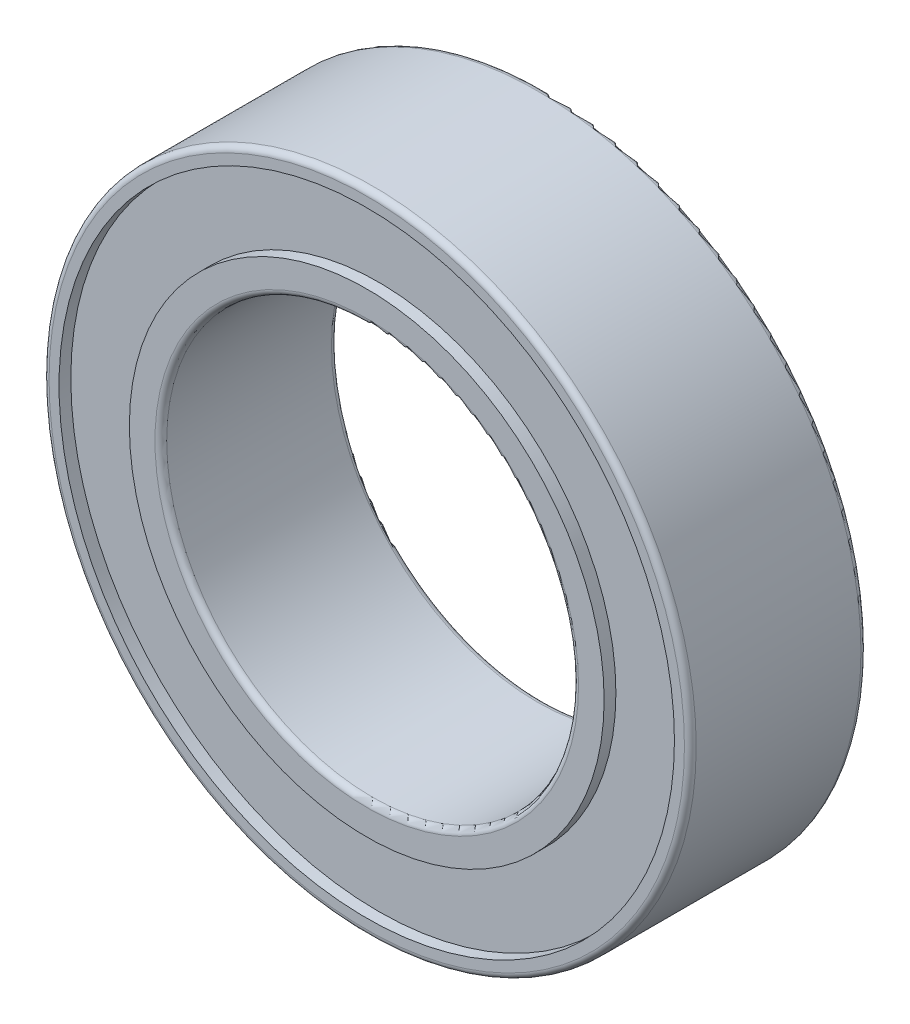
ISO-10303-21;
HEADER;
FILE_DESCRIPTION(('STEP AP214'),'2;1');
FILE_NAME('part.step','',(''),(''),'','','');
FILE_SCHEMA(('AUTOMOTIVE_DESIGN { 1 0 10303 214 1 1 1 1 }'));
ENDSEC;
DATA;
#1=APPLICATION_CONTEXT('core data for automotive mechanical design processes');
#2=APPLICATION_PROTOCOL_DEFINITION('international standard','automotive_design',2000,#1);
#3=PRODUCT_CONTEXT('',#1,'mechanical');
#4=PRODUCT('Part','Part','',(#3));
#5=PRODUCT_RELATED_PRODUCT_CATEGORY('part','',(#4));
#6=PRODUCT_DEFINITION_FORMATION('','',#4);
#7=PRODUCT_DEFINITION_CONTEXT('part definition',#1,'design');
#8=PRODUCT_DEFINITION('design','',#6,#7);
#9=PRODUCT_DEFINITION_SHAPE('','',#8);
#10=(LENGTH_UNIT() NAMED_UNIT(*) SI_UNIT(.MILLI.,.METRE.));
#11=(NAMED_UNIT(*) PLANE_ANGLE_UNIT() SI_UNIT($,.RADIAN.));
#12=(NAMED_UNIT(*) SI_UNIT($,.STERADIAN.) SOLID_ANGLE_UNIT());
#13=UNCERTAINTY_MEASURE_WITH_UNIT(LENGTH_MEASURE(1.E-05),#10,'distance_accuracy_value','');
#14=(GEOMETRIC_REPRESENTATION_CONTEXT(3) GLOBAL_UNCERTAINTY_ASSIGNED_CONTEXT((#13)) GLOBAL_UNIT_ASSIGNED_CONTEXT((#10,
#11,#12)) REPRESENTATION_CONTEXT('',''));
#15=CARTESIAN_POINT('',(0.,0.,0.));
#16=DIRECTION('',(0.,0.,1.));
#17=DIRECTION('',(1.,0.,0.));
#18=AXIS2_PLACEMENT_3D('',#15,#16,#17);
#19=CARTESIAN_POINT('',(-4.03500000000001,-4.03500000000003,0.));
#20=DIRECTION('',(0.,0.,1.));
#21=DIRECTION('',(1.,0.,0.));
#22=AXIS2_PLACEMENT_3D('',#19,#20,#21);
#23=PLANE('',#22);
#24=CARTESIAN_POINT('',(0.,0.,0.));
#25=DIRECTION('',(0.,0.,1.));
#26=DIRECTION('',(-1.,0.,0.));
#27=AXIS2_PLACEMENT_3D('',#24,#25,#26);
#28=CIRCLE('',#27,4.035);
#29=CARTESIAN_POINT('',(-4.035,0.,0.));
#30=VERTEX_POINT('',#29);
#31=EDGE_CURVE('E67',#30,#30,#28,.F.);
#32=ORIENTED_EDGE('',*,*,#31,.F.);
#33=EDGE_LOOP('',(#32));
#34=FACE_BOUND('',#33,.T.);
#35=CARTESIAN_POINT('',(0.,0.,0.));
#36=DIRECTION('',(0.,0.,-1.));
#37=DIRECTION('',(1.,0.,0.));
#38=AXIS2_PLACEMENT_3D('',#35,#36,#37);
#39=CIRCLE('',#38,3.59999999999993);
#40=CARTESIAN_POINT('',(3.59999999999993,0.,0.));
#41=VERTEX_POINT('',#40);
#42=EDGE_CURVE('E64',#41,#41,#39,.T.);
#43=ORIENTED_EDGE('',*,*,#42,.T.);
#44=EDGE_LOOP('',(#43));
#45=FACE_BOUND('',#44,.T.);
#46=ADVANCED_FACE('F14',(#34,#45),#23,.T.);
#47=CARTESIAN_POINT('',(4.035,-4.035,-3.));
#48=DIRECTION('',(0.,0.,-1.));
#49=DIRECTION('',(-1.,0.,0.));
#50=AXIS2_PLACEMENT_3D('',#47,#48,#49);
#51=PLANE('',#50);
#52=CARTESIAN_POINT('',(0.,0.,-3.));
#53=DIRECTION('',(0.,0.,-1.));
#54=DIRECTION('',(1.,0.,0.));
#55=AXIS2_PLACEMENT_3D('',#52,#53,#54);
#56=CIRCLE('',#55,4.035);
#57=CARTESIAN_POINT('',(4.035,0.,-3.));
#58=VERTEX_POINT('',#57);
#59=EDGE_CURVE('E61',#58,#58,#56,.T.);
#60=ORIENTED_EDGE('',*,*,#59,.T.);
#61=EDGE_LOOP('',(#60));
#62=FACE_BOUND('',#61,.T.);
#63=CARTESIAN_POINT('',(0.,0.,-3.));
#64=DIRECTION('',(0.,0.,1.));
#65=DIRECTION('',(-1.,0.,0.));
#66=AXIS2_PLACEMENT_3D('',#63,#64,#65);
#67=CIRCLE('',#66,3.60000001788124);
#68=CARTESIAN_POINT('',(-3.60000001788124,0.,-3.));
#69=VERTEX_POINT('',#68);
#70=EDGE_CURVE('E58',#69,#69,#67,.F.);
#71=ORIENTED_EDGE('',*,*,#70,.F.);
#72=EDGE_LOOP('',(#71));
#73=FACE_BOUND('',#72,.T.);
#74=ADVANCED_FACE('F75',(#62,#73),#51,.T.);
#75=CARTESIAN_POINT('',(5.23,-5.30055069282541,-2.8));
#76=DIRECTION('',(0.,0.,-1.));
#77=DIRECTION('',(-1.,0.,0.));
#78=AXIS2_PLACEMENT_3D('',#75,#76,#77);
#79=PLANE('',#78);
#80=CARTESIAN_POINT('',(0.,0.,-2.8));
#81=DIRECTION('',(0.,0.,-1.));
#82=DIRECTION('',(1.,0.,0.));
#83=AXIS2_PLACEMENT_3D('',#80,#81,#82);
#84=CIRCLE('',#83,5.23);
#85=CARTESIAN_POINT('',(5.23,0.,-2.8));
#86=VERTEX_POINT('',#85);
#87=EDGE_CURVE('E55',#86,#86,#84,.T.);
#88=ORIENTED_EDGE('',*,*,#87,.T.);
#89=EDGE_LOOP('',(#88));
#90=FACE_BOUND('',#89,.T.);
#91=CARTESIAN_POINT('',(0.,0.,-2.8));
#92=DIRECTION('',(0.,0.,1.));
#93=DIRECTION('',(-1.,0.,0.));
#94=AXIS2_PLACEMENT_3D('',#91,#92,#93);
#95=CIRCLE('',#94,4.035);
#96=CARTESIAN_POINT('',(-4.035,0.,-2.8));
#97=VERTEX_POINT('',#96);
#98=EDGE_CURVE('E52',#97,#97,#95,.F.);
#99=ORIENTED_EDGE('',*,*,#98,.F.);
#100=EDGE_LOOP('',(#99));
#101=FACE_BOUND('',#100,.T.);
#102=ADVANCED_FACE('F134',(#90,#101),#79,.T.);
#103=CARTESIAN_POINT('',(5.4,-5.4,-3.));
#104=DIRECTION('',(0.,0.,-1.));
#105=DIRECTION('',(-1.,0.,0.));
#106=AXIS2_PLACEMENT_3D('',#103,#104,#105);
#107=PLANE('',#106);
#108=CARTESIAN_POINT('',(0.,0.,-3.));
#109=DIRECTION('',(0.,0.,-1.));
#110=DIRECTION('',(1.,0.,0.));
#111=AXIS2_PLACEMENT_3D('',#108,#109,#110);
#112=CIRCLE('',#111,5.4);
#113=CARTESIAN_POINT('',(5.4,0.,-3.));
#114=VERTEX_POINT('',#113);
#115=EDGE_CURVE('E49',#114,#114,#112,.T.);
#116=ORIENTED_EDGE('',*,*,#115,.T.);
#117=EDGE_LOOP('',(#116));
#118=FACE_BOUND('',#117,.T.);
#119=CARTESIAN_POINT('',(0.,0.,-3.));
#120=DIRECTION('',(0.,0.,1.));
#121=DIRECTION('',(-1.,0.,0.));
#122=AXIS2_PLACEMENT_3D('',#119,#120,#121);
#123=CIRCLE('',#122,5.23);
#124=CARTESIAN_POINT('',(-5.23,0.,-3.));
#125=VERTEX_POINT('',#124);
#126=EDGE_CURVE('E46',#125,#125,#123,.F.);
#127=ORIENTED_EDGE('',*,*,#126,.F.);
#128=EDGE_LOOP('',(#127));
#129=FACE_BOUND('',#128,.T.);
#130=ADVANCED_FACE('F129',(#118,#129),#107,.T.);
#131=CARTESIAN_POINT('',(-5.4,-5.4,0.));
#132=DIRECTION('',(0.,0.,1.));
#133=DIRECTION('',(1.,0.,0.));
#134=AXIS2_PLACEMENT_3D('',#131,#132,#133);
#135=PLANE('',#134);
#136=CARTESIAN_POINT('',(0.,0.,0.));
#137=DIRECTION('',(0.,0.,1.));
#138=DIRECTION('',(-1.,0.,0.));
#139=AXIS2_PLACEMENT_3D('',#136,#137,#138);
#140=CIRCLE('',#139,5.40000000745066);
#141=CARTESIAN_POINT('',(-5.40000000745066,0.,0.));
#142=VERTEX_POINT('',#141);
#143=EDGE_CURVE('E43',#142,#142,#140,.F.);
#144=ORIENTED_EDGE('',*,*,#143,.F.);
#145=EDGE_LOOP('',(#144));
#146=FACE_BOUND('',#145,.T.);
#147=CARTESIAN_POINT('',(0.,0.,0.));
#148=DIRECTION('',(0.,0.,-1.));
#149=DIRECTION('',(1.,0.,0.));
#150=AXIS2_PLACEMENT_3D('',#147,#148,#149);
#151=CIRCLE('',#150,5.23);
#152=CARTESIAN_POINT('',(5.23,0.,0.));
#153=VERTEX_POINT('',#152);
#154=EDGE_CURVE('E40',#153,#153,#151,.T.);
#155=ORIENTED_EDGE('',*,*,#154,.T.);
#156=EDGE_LOOP('',(#155));
#157=FACE_BOUND('',#156,.T.);
#158=ADVANCED_FACE('F93',(#146,#157),#135,.T.);
#159=CARTESIAN_POINT('',(-5.23,-5.30055069282541,-0.2));
#160=DIRECTION('',(0.,0.,1.));
#161=DIRECTION('',(1.,0.,0.));
#162=AXIS2_PLACEMENT_3D('',#159,#160,#161);
#163=PLANE('',#162);
#164=CARTESIAN_POINT('',(0.,0.,-0.2));
#165=DIRECTION('',(0.,0.,1.));
#166=DIRECTION('',(-1.,0.,0.));
#167=AXIS2_PLACEMENT_3D('',#164,#165,#166);
#168=CIRCLE('',#167,5.23);
#169=CARTESIAN_POINT('',(-5.23,0.,-0.2));
#170=VERTEX_POINT('',#169);
#171=EDGE_CURVE('E37',#170,#170,#168,.F.);
#172=ORIENTED_EDGE('',*,*,#171,.F.);
#173=EDGE_LOOP('',(#172));
#174=FACE_BOUND('',#173,.T.);
#175=CARTESIAN_POINT('',(0.,0.,-0.2));
#176=DIRECTION('',(0.,0.,-1.));
#177=DIRECTION('',(1.,0.,0.));
#178=AXIS2_PLACEMENT_3D('',#175,#176,#177);
#179=CIRCLE('',#178,4.035);
#180=CARTESIAN_POINT('',(4.035,0.,-0.2));
#181=VERTEX_POINT('',#180);
#182=EDGE_CURVE('E34',#181,#181,#179,.T.);
#183=ORIENTED_EDGE('',*,*,#182,.T.);
#184=EDGE_LOOP('',(#183));
#185=FACE_BOUND('',#184,.T.);
#186=ADVANCED_FACE('F82',(#174,#185),#163,.T.);
#187=CARTESIAN_POINT('',(0.,0.,-0.099999999999923));
#188=DIRECTION('',(0.,0.,-1.));
#189=DIRECTION('',(1.,0.,0.));
#190=AXIS2_PLACEMENT_3D('',#187,#188,#189);
#191=TOROIDAL_SURFACE('',#190,3.59999999999993,0.099999999999923);
#192=CARTESIAN_POINT('',(0.,0.,-0.1));
#193=DIRECTION('',(0.,0.,-1.));
#194=DIRECTION('',(1.,0.,0.));
#195=AXIS2_PLACEMENT_3D('',#192,#193,#194);
#196=CIRCLE('',#195,3.5);
#197=CARTESIAN_POINT('',(3.5,0.,-0.1));
#198=VERTEX_POINT('',#197);
#199=EDGE_CURVE('E29',#198,#198,#196,.T.);
#200=ORIENTED_EDGE('',*,*,#199,.T.);
#201=EDGE_LOOP('',(#200));
#202=FACE_BOUND('',#201,.T.);
#203=ORIENTED_EDGE('',*,*,#42,.F.);
#204=EDGE_LOOP('',(#203));
#205=FACE_BOUND('',#204,.T.);
#206=ADVANCED_FACE('F79',(#202,#205),#191,.T.);
#207=CARTESIAN_POINT('',(0.,0.,-3.));
#208=DIRECTION('',(0.,0.,-1.));
#209=DIRECTION('',(1.,0.,0.));
#210=AXIS2_PLACEMENT_3D('',#207,#208,#209);
#211=CYLINDRICAL_SURFACE('',#210,3.5);
#212=CARTESIAN_POINT('',(0.,0.,-2.9));
#213=DIRECTION('',(0.,0.,-1.));
#214=DIRECTION('',(1.,0.,0.));
#215=AXIS2_PLACEMENT_3D('',#212,#213,#214);
#216=CIRCLE('',#215,3.5);
#217=CARTESIAN_POINT('',(3.5,0.,-2.9));
#218=VERTEX_POINT('',#217);
#219=EDGE_CURVE('E25',#218,#218,#216,.T.);
#220=ORIENTED_EDGE('',*,*,#219,.T.);
#221=EDGE_LOOP('',(#220));
#222=FACE_BOUND('',#221,.T.);
#223=ORIENTED_EDGE('',*,*,#199,.F.);
#224=EDGE_LOOP('',(#223));
#225=FACE_BOUND('',#224,.T.);
#226=ADVANCED_FACE('F81',(#222,#225),#211,.F.);
#227=CARTESIAN_POINT('',(0.,0.,-2.90000000000015));
#228=DIRECTION('',(0.,0.,-1.));
#229=DIRECTION('',(0.99999999999999,1.42046885487697E-07,0.));
#230=AXIS2_PLACEMENT_3D('',#227,#228,#229);
#231=TOROIDAL_SURFACE('',#230,3.59999999999985,0.0999999999998467);
#232=ORIENTED_EDGE('',*,*,#70,.T.);
#233=EDGE_LOOP('',(#232));
#234=FACE_BOUND('',#233,.T.);
#235=ORIENTED_EDGE('',*,*,#219,.F.);
#236=EDGE_LOOP('',(#235));
#237=FACE_BOUND('',#236,.T.);
#238=ADVANCED_FACE('F90',(#234,#237),#231,.T.);
#239=CARTESIAN_POINT('',(0.,0.,-3.));
#240=DIRECTION('',(0.,0.,-1.));
#241=DIRECTION('',(0.99999999999999,1.42053890994982E-07,0.));
#242=AXIS2_PLACEMENT_3D('',#239,#240,#241);
#243=CYLINDRICAL_SURFACE('',#242,4.035);
#244=ORIENTED_EDGE('',*,*,#98,.T.);
#245=EDGE_LOOP('',(#244));
#246=FACE_BOUND('',#245,.T.);
#247=ORIENTED_EDGE('',*,*,#59,.F.);
#248=EDGE_LOOP('',(#247));
#249=FACE_BOUND('',#248,.T.);
#250=ADVANCED_FACE('F100',(#246,#249),#243,.T.);
#251=CARTESIAN_POINT('',(0.,0.,-3.));
#252=DIRECTION('',(0.,0.,-1.));
#253=DIRECTION('',(1.,0.,0.));
#254=AXIS2_PLACEMENT_3D('',#251,#252,#253);
#255=CYLINDRICAL_SURFACE('',#254,5.23);
#256=ORIENTED_EDGE('',*,*,#126,.T.);
#257=EDGE_LOOP('',(#256));
#258=FACE_BOUND('',#257,.T.);
#259=ORIENTED_EDGE('',*,*,#87,.F.);
#260=EDGE_LOOP('',(#259));
#261=FACE_BOUND('',#260,.T.);
#262=ADVANCED_FACE('F104',(#258,#261),#255,.F.);
#263=CARTESIAN_POINT('',(0.,0.,-2.90000000000015));
#264=DIRECTION('',(0.,0.,-1.));
#265=DIRECTION('',(1.,0.,0.));
#266=AXIS2_PLACEMENT_3D('',#263,#264,#265);
#267=TOROIDAL_SURFACE('',#266,5.40000000000016,0.099999999999845);
#268=CARTESIAN_POINT('',(0.,0.,-2.90000000000015));
#269=DIRECTION('',(0.,0.,-1.));
#270=DIRECTION('',(1.,0.,0.));
#271=AXIS2_PLACEMENT_3D('',#268,#269,#270);
#272=CIRCLE('',#271,5.50000000000001);
#273=CARTESIAN_POINT('',(5.50000000000001,0.,-2.90000000000015));
#274=VERTEX_POINT('',#273);
#275=EDGE_CURVE('E21',#274,#274,#272,.T.);
#276=ORIENTED_EDGE('',*,*,#275,.T.);
#277=EDGE_LOOP('',(#276));
#278=FACE_BOUND('',#277,.T.);
#279=ORIENTED_EDGE('',*,*,#115,.F.);
#280=EDGE_LOOP('',(#279));
#281=FACE_BOUND('',#280,.T.);
#282=ADVANCED_FACE('F108',(#278,#281),#267,.T.);
#283=CARTESIAN_POINT('',(0.,0.,-3.));
#284=DIRECTION('',(0.,0.,-1.));
#285=DIRECTION('',(1.,0.,0.));
#286=AXIS2_PLACEMENT_3D('',#283,#284,#285);
#287=CYLINDRICAL_SURFACE('',#286,5.5);
#288=CARTESIAN_POINT('',(0.,0.,-0.0999999999999219));
#289=DIRECTION('',(0.,0.,-1.));
#290=DIRECTION('',(1.,0.,0.));
#291=AXIS2_PLACEMENT_3D('',#288,#289,#290);
#292=CIRCLE('',#291,5.5);
#293=CARTESIAN_POINT('',(5.5,0.,-0.0999999999999219));
#294=VERTEX_POINT('',#293);
#295=EDGE_CURVE('E9',#294,#294,#292,.T.);
#296=ORIENTED_EDGE('',*,*,#295,.T.);
#297=EDGE_LOOP('',(#296));
#298=FACE_BOUND('',#297,.T.);
#299=ORIENTED_EDGE('',*,*,#275,.F.);
#300=EDGE_LOOP('',(#299));
#301=FACE_BOUND('',#300,.T.);
#302=ADVANCED_FACE('F112',(#298,#301),#287,.T.);
#303=CARTESIAN_POINT('',(0.,0.,-0.0999999999999217));
#304=DIRECTION('',(0.,0.,-1.));
#305=DIRECTION('',(1.,0.,0.));
#306=AXIS2_PLACEMENT_3D('',#303,#304,#305);
#307=TOROIDAL_SURFACE('',#306,5.40000000000008,0.0999999999999222);
#308=ORIENTED_EDGE('',*,*,#143,.T.);
#309=EDGE_LOOP('',(#308));
#310=FACE_BOUND('',#309,.T.);
#311=ORIENTED_EDGE('',*,*,#295,.F.);
#312=EDGE_LOOP('',(#311));
#313=FACE_BOUND('',#312,.T.);
#314=ADVANCED_FACE('F115',(#310,#313),#307,.T.);
#315=CARTESIAN_POINT('',(0.,0.,-3.));
#316=DIRECTION('',(0.,0.,-1.));
#317=DIRECTION('',(1.,0.,0.));
#318=AXIS2_PLACEMENT_3D('',#315,#316,#317);
#319=CYLINDRICAL_SURFACE('',#318,5.23);
#320=ORIENTED_EDGE('',*,*,#171,.T.);
#321=EDGE_LOOP('',(#320));
#322=FACE_BOUND('',#321,.T.);
#323=ORIENTED_EDGE('',*,*,#154,.F.);
#324=EDGE_LOOP('',(#323));
#325=FACE_BOUND('',#324,.T.);
#326=ADVANCED_FACE('F117',(#322,#325),#319,.F.);
#327=CARTESIAN_POINT('',(0.,0.,-3.));
#328=DIRECTION('',(0.,0.,-1.));
#329=DIRECTION('',(0.99999999999999,1.42331219821552E-07,0.));
#330=AXIS2_PLACEMENT_3D('',#327,#328,#329);
#331=CYLINDRICAL_SURFACE('',#330,4.035);
#332=ORIENTED_EDGE('',*,*,#31,.T.);
#333=EDGE_LOOP('',(#332));
#334=FACE_BOUND('',#333,.T.);
#335=ORIENTED_EDGE('',*,*,#182,.F.);
#336=EDGE_LOOP('',(#335));
#337=FACE_BOUND('',#336,.T.);
#338=ADVANCED_FACE('F16',(#334,#337),#331,.T.);
#339=CLOSED_SHELL('',(#46,#74,#102,#130,#158,#186,#206,#226,#238,#250,#262,#282,#302,#314,#326,#338));
#340=MANIFOLD_SOLID_BREP('B1',#339);
#341=ADVANCED_BREP_SHAPE_REPRESENTATION('',(#18,#340),#14);
#342=SHAPE_DEFINITION_REPRESENTATION(#9,#341);
ENDSEC;
END-ISO-10303-21;
